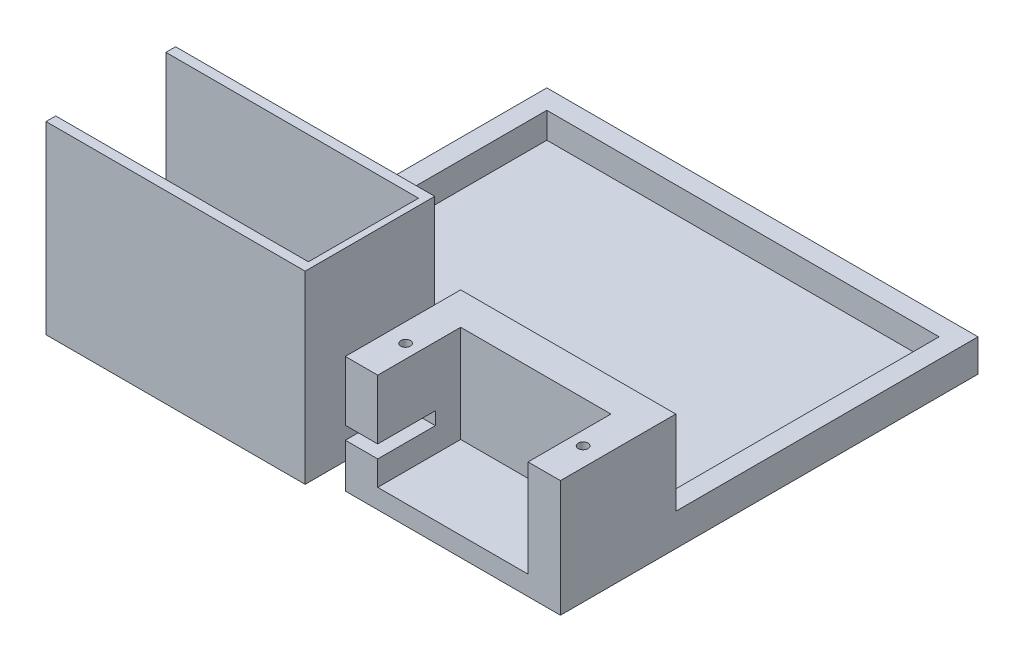
ISO-10303-21;
HEADER;
FILE_DESCRIPTION(('STEP AP214'),'2;1');
FILE_NAME('part.step','',(''),(''),'','','');
FILE_SCHEMA(('AUTOMOTIVE_DESIGN { 1 0 10303 214 1 1 1 1 }'));
ENDSEC;
DATA;
#1=APPLICATION_CONTEXT('core data for automotive mechanical design processes');
#2=APPLICATION_PROTOCOL_DEFINITION('international standard','automotive_design',2000,#1);
#3=PRODUCT_CONTEXT('',#1,'mechanical');
#4=PRODUCT('Part','Part','',(#3));
#5=PRODUCT_RELATED_PRODUCT_CATEGORY('part','',(#4));
#6=PRODUCT_DEFINITION_FORMATION('','',#4);
#7=PRODUCT_DEFINITION_CONTEXT('part definition',#1,'design');
#8=PRODUCT_DEFINITION('design','',#6,#7);
#9=PRODUCT_DEFINITION_SHAPE('','',#8);
#10=(LENGTH_UNIT() NAMED_UNIT(*) SI_UNIT(.MILLI.,.METRE.));
#11=(NAMED_UNIT(*) PLANE_ANGLE_UNIT() SI_UNIT($,.RADIAN.));
#12=(NAMED_UNIT(*) SI_UNIT($,.STERADIAN.) SOLID_ANGLE_UNIT());
#13=UNCERTAINTY_MEASURE_WITH_UNIT(LENGTH_MEASURE(1.E-05),#10,'distance_accuracy_value','');
#14=(GEOMETRIC_REPRESENTATION_CONTEXT(3) GLOBAL_UNCERTAINTY_ASSIGNED_CONTEXT((#13)) GLOBAL_UNIT_ASSIGNED_CONTEXT((#10,
#11,#12)) REPRESENTATION_CONTEXT('',''));
#15=CARTESIAN_POINT('',(0.,0.,0.));
#16=DIRECTION('',(0.,0.,1.));
#17=DIRECTION('',(1.,0.,0.));
#18=AXIS2_PLACEMENT_3D('',#15,#16,#17);
#19=CARTESIAN_POINT('',(-38.65,1.7,-17.5));
#20=DIRECTION('',(0.,0.,1.));
#21=DIRECTION('',(1.,0.,0.));
#22=AXIS2_PLACEMENT_3D('',#19,#20,#21);
#23=PLANE('',#22);
#24=DIRECTION('',(-1.,0.,0.));
#25=VECTOR('',#24,1.);
#26=CARTESIAN_POINT('',(-38.65,1.7,-17.5));
#27=LINE('',#26,#25);
#28=CARTESIAN_POINT('',(-5.3,1.7,-17.5));
#29=VERTEX_POINT('',#28);
#30=CARTESIAN_POINT('',(-9.3,1.7,-17.5));
#31=VERTEX_POINT('',#30);
#32=EDGE_CURVE('E446',#29,#31,#27,.T.);
#33=ORIENTED_EDGE('',*,*,#32,.T.);
#34=DIRECTION('',(0.,-1.,0.));
#35=VECTOR('',#34,1.);
#36=CARTESIAN_POINT('',(-9.3,1.7,-17.5));
#37=LINE('',#36,#35);
#38=CARTESIAN_POINT('',(-9.3,-3.3,-17.5));
#39=VERTEX_POINT('',#38);
#40=EDGE_CURVE('E11',#31,#39,#37,.T.);
#41=ORIENTED_EDGE('',*,*,#40,.T.);
#42=DIRECTION('',(-1.,0.,0.));
#43=VECTOR('',#42,1.);
#44=CARTESIAN_POINT('',(-38.65,-3.3,-17.5));
#45=LINE('',#44,#43);
#46=CARTESIAN_POINT('',(-5.3,-3.3,-17.5));
#47=VERTEX_POINT('',#46);
#48=EDGE_CURVE('E454',#47,#39,#45,.T.);
#49=ORIENTED_EDGE('',*,*,#48,.F.);
#50=DIRECTION('',(0.,-1.,0.));
#51=VECTOR('',#50,1.);
#52=CARTESIAN_POINT('',(-5.3,55.275054314054,-17.5));
#53=LINE('',#52,#51);
#54=EDGE_CURVE('E543',#29,#47,#53,.T.);
#55=ORIENTED_EDGE('',*,*,#54,.F.);
#56=EDGE_LOOP('',(#33,#41,#49,#55));
#57=FACE_BOUND('',#56,.T.);
#58=ADVANCED_FACE('F38',(#57),#23,.T.);
#59=CARTESIAN_POINT('',(-5.3,-3.301,0.3));
#60=DIRECTION('',(0.,0.,-1.));
#61=DIRECTION('',(-1.,0.,0.));
#62=AXIS2_PLACEMENT_3D('',#59,#60,#61);
#63=PLANE('',#62);
#64=DIRECTION('',(0.,-1.,0.));
#65=VECTOR('',#64,1.);
#66=CARTESIAN_POINT('',(-0.3,55.275054314054,0.3));
#67=LINE('',#66,#65);
#68=CARTESIAN_POINT('',(-0.300000000000002,3.5,0.300000000000001));
#69=VERTEX_POINT('',#68);
#70=CARTESIAN_POINT('',(-0.3,-0.3,0.3));
#71=VERTEX_POINT('',#70);
#72=EDGE_CURVE('E518',#69,#71,#67,.T.);
#73=ORIENTED_EDGE('',*,*,#72,.F.);
#74=DIRECTION('',(-1.,0.,0.));
#75=VECTOR('',#74,1.);
#76=CARTESIAN_POINT('',(27.901,3.5,0.3));
#77=LINE('',#76,#75);
#78=CARTESIAN_POINT('',(-5.3,3.5,0.3));
#79=VERTEX_POINT('',#78);
#80=EDGE_CURVE('E324',#69,#79,#77,.T.);
#81=ORIENTED_EDGE('',*,*,#80,.T.);
#82=DIRECTION('',(0.,1.,0.));
#83=VECTOR('',#82,1.);
#84=CARTESIAN_POINT('',(-5.3,-3.301,0.3));
#85=LINE('',#84,#83);
#86=CARTESIAN_POINT('',(-5.3,-3.3,0.300000000000001));
#87=VERTEX_POINT('',#86);
#88=EDGE_CURVE('E341',#87,#79,#85,.T.);
#89=ORIENTED_EDGE('',*,*,#88,.F.);
#90=DIRECTION('',(-1.,0.,0.));
#91=VECTOR('',#90,1.);
#92=CARTESIAN_POINT('',(-5.3,-3.3,0.3));
#93=LINE('',#92,#91);
#94=CARTESIAN_POINT('',(27.9,-3.3,0.300000000000002));
#95=VERTEX_POINT('',#94);
#96=EDGE_CURVE('E329',#95,#87,#93,.T.);
#97=ORIENTED_EDGE('',*,*,#96,.F.);
#98=DIRECTION('',(0.,1.,0.));
#99=VECTOR('',#98,1.);
#100=CARTESIAN_POINT('',(27.9,-3.301,0.300000000000002));
#101=LINE('',#100,#99);
#102=CARTESIAN_POINT('',(27.9,14.7,0.300000000000002));
#103=VERTEX_POINT('',#102);
#104=EDGE_CURVE('E340',#95,#103,#101,.T.);
#105=ORIENTED_EDGE('',*,*,#104,.T.);
#106=DIRECTION('',(-1.,0.,0.));
#107=VECTOR('',#106,1.);
#108=CARTESIAN_POINT('',(-5.3,14.7,0.3));
#109=LINE('',#108,#107);
#110=CARTESIAN_POINT('',(22.9,14.7,0.300000000000001));
#111=VERTEX_POINT('',#110);
#112=EDGE_CURVE('E337',#103,#111,#109,.T.);
#113=ORIENTED_EDGE('',*,*,#112,.T.);
#114=DIRECTION('',(0.,-1.,0.));
#115=VECTOR('',#114,1.);
#116=CARTESIAN_POINT('',(22.9,55.275054314054,0.3));
#117=LINE('',#116,#115);
#118=CARTESIAN_POINT('',(22.9,-0.3,0.300000000000001));
#119=VERTEX_POINT('',#118);
#120=EDGE_CURVE('E508',#111,#119,#117,.T.);
#121=ORIENTED_EDGE('',*,*,#120,.T.);
#122=DIRECTION('',(-1.,0.,0.));
#123=VECTOR('',#122,1.);
#124=CARTESIAN_POINT('',(22.9,-0.3,0.3));
#125=LINE('',#124,#123);
#126=EDGE_CURVE('E503',#119,#71,#125,.T.);
#127=ORIENTED_EDGE('',*,*,#126,.T.);
#128=EDGE_LOOP('',(#73,#81,#89,#97,#105,#113,#121,#127));
#129=FACE_BOUND('',#128,.T.);
#130=ADVANCED_FACE('F600',(#129),#63,.F.);
#131=CARTESIAN_POINT('',(-38.65,1.7,-17.5));
#132=DIRECTION('',(-1.,0.,0.));
#133=DIRECTION('',(0.,0.,1.));
#134=AXIS2_PLACEMENT_3D('',#131,#132,#133);
#135=PLANE('',#134);
#136=DIRECTION('',(0.,0.,-1.));
#137=VECTOR('',#136,1.);
#138=CARTESIAN_POINT('',(-38.65,-2.3,-17.5));
#139=LINE('',#138,#137);
#140=CARTESIAN_POINT('',(-38.65,-2.3,-20.5));
#141=VERTEX_POINT('',#140);
#142=CARTESIAN_POINT('',(-38.65,-2.3,-40.825));
#143=VERTEX_POINT('',#142);
#144=EDGE_CURVE('E379',#141,#143,#139,.T.);
#145=ORIENTED_EDGE('',*,*,#144,.T.);
#146=DIRECTION('',(0.,1.,0.));
#147=VECTOR('',#146,1.);
#148=CARTESIAN_POINT('',(-38.65,1.7,-40.825));
#149=LINE('',#148,#147);
#150=CARTESIAN_POINT('',(-38.65,1.7,-40.825));
#151=VERTEX_POINT('',#150);
#152=EDGE_CURVE('E383',#143,#151,#149,.T.);
#153=ORIENTED_EDGE('',*,*,#152,.T.);
#154=DIRECTION('',(0.,0.,-1.));
#155=VECTOR('',#154,1.);
#156=CARTESIAN_POINT('',(-38.65,1.7,-17.5));
#157=LINE('',#156,#155);
#158=CARTESIAN_POINT('',(-38.65,1.7,-64.15));
#159=VERTEX_POINT('',#158);
#160=EDGE_CURVE('E433',#151,#159,#157,.T.);
#161=ORIENTED_EDGE('',*,*,#160,.T.);
#162=DIRECTION('',(0.,-1.,0.));
#163=VECTOR('',#162,1.);
#164=CARTESIAN_POINT('',(-38.65,1.7,-64.15));
#165=LINE('',#164,#163);
#166=CARTESIAN_POINT('',(-38.65,-3.3,-64.15));
#167=VERTEX_POINT('',#166);
#168=EDGE_CURVE('E445',#159,#167,#165,.T.);
#169=ORIENTED_EDGE('',*,*,#168,.T.);
#170=DIRECTION('',(0.,0.,-1.));
#171=VECTOR('',#170,1.);
#172=CARTESIAN_POINT('',(-38.65,-3.3,-17.5));
#173=LINE('',#172,#171);
#174=CARTESIAN_POINT('',(-38.65,-3.3,-17.5));
#175=VERTEX_POINT('',#174);
#176=EDGE_CURVE('E421',#175,#167,#173,.T.);
#177=ORIENTED_EDGE('',*,*,#176,.F.);
#178=DIRECTION('',(0.,-1.,0.));
#179=VECTOR('',#178,1.);
#180=CARTESIAN_POINT('',(-38.65,1.7,-17.5));
#181=LINE('',#180,#179);
#182=CARTESIAN_POINT('',(-38.65,1.7,-17.5));
#183=VERTEX_POINT('',#182);
#184=EDGE_CURVE('E458',#183,#175,#181,.T.);
#185=ORIENTED_EDGE('',*,*,#184,.F.);
#186=CARTESIAN_POINT('',(-38.65,1.7,-20.5));
#187=VERTEX_POINT('',#186);
#188=EDGE_CURVE('E428',#183,#187,#157,.T.);
#189=ORIENTED_EDGE('',*,*,#188,.T.);
#190=DIRECTION('',(0.,-1.,0.));
#191=VECTOR('',#190,1.);
#192=CARTESIAN_POINT('',(-38.65,1.7,-20.5));
#193=LINE('',#192,#191);
#194=EDGE_CURVE('E375',#187,#141,#193,.T.);
#195=ORIENTED_EDGE('',*,*,#194,.T.);
#196=EDGE_LOOP('',(#145,#153,#161,#169,#177,#185,#189,#195));
#197=FACE_BOUND('',#196,.T.);
#198=ADVANCED_FACE('F636',(#197),#135,.T.);
#199=CARTESIAN_POINT('',(0.,1.7,0.));
#200=DIRECTION('',(0.,-1.,0.));
#201=DIRECTION('',(0.,0.,-1.));
#202=AXIS2_PLACEMENT_3D('',#199,#200,#201);
#203=PLANE('',#202);
#204=DIRECTION('',(1.,0.,0.));
#205=VECTOR('',#204,1.);
#206=CARTESIAN_POINT('',(-39.65,1.7,-40.825));
#207=LINE('',#206,#205);
#208=CARTESIAN_POINT('',(-35.65,1.7,-40.825));
#209=VERTEX_POINT('',#208);
#210=EDGE_CURVE('E368',#151,#209,#207,.T.);
#211=ORIENTED_EDGE('',*,*,#210,.T.);
#212=DIRECTION('',(0.,0.,1.));
#213=VECTOR('',#212,1.);
#214=CARTESIAN_POINT('',(-35.65,1.7,-61.15));
#215=LINE('',#214,#213);
#216=CARTESIAN_POINT('',(-35.65,1.7,-61.15));
#217=VERTEX_POINT('',#216);
#218=EDGE_CURVE('E411',#217,#209,#215,.T.);
#219=ORIENTED_EDGE('',*,*,#218,.F.);
#220=DIRECTION('',(-1.,0.,0.));
#221=VECTOR('',#220,1.);
#222=CARTESIAN_POINT('',(24.9,1.7,-61.15));
#223=LINE('',#222,#221);
#224=CARTESIAN_POINT('',(24.9,1.7,-61.15));
#225=VERTEX_POINT('',#224);
#226=EDGE_CURVE('E407',#225,#217,#223,.T.);
#227=ORIENTED_EDGE('',*,*,#226,.F.);
#228=DIRECTION('',(0.,0.,-1.));
#229=VECTOR('',#228,1.);
#230=CARTESIAN_POINT('',(24.9,1.7,-20.5));
#231=LINE('',#230,#229);
#232=CARTESIAN_POINT('',(24.9,1.7,-20.5));
#233=VERTEX_POINT('',#232);
#234=EDGE_CURVE('E387',#233,#225,#231,.T.);
#235=ORIENTED_EDGE('',*,*,#234,.F.);
#236=DIRECTION('',(1.,0.,0.));
#237=VECTOR('',#236,1.);
#238=CARTESIAN_POINT('',(-5.3,1.7,-20.5));
#239=LINE('',#238,#237);
#240=EDGE_CURVE('E393',#187,#233,#239,.T.);
#241=ORIENTED_EDGE('',*,*,#240,.F.);
#242=ORIENTED_EDGE('',*,*,#188,.F.);
#243=EDGE_CURVE('E440',#31,#183,#27,.T.);
#244=ORIENTED_EDGE('',*,*,#243,.F.);
#245=ORIENTED_EDGE('',*,*,#32,.F.);
#246=CARTESIAN_POINT('',(27.9,1.7,-17.5));
#247=VERTEX_POINT('',#246);
#248=EDGE_CURVE('E441',#247,#29,#27,.T.);
#249=ORIENTED_EDGE('',*,*,#248,.F.);
#250=DIRECTION('',(0.,0.,1.));
#251=VECTOR('',#250,1.);
#252=CARTESIAN_POINT('',(27.9,1.7,-17.5));
#253=LINE('',#252,#251);
#254=CARTESIAN_POINT('',(27.9,1.7,-64.15));
#255=VERTEX_POINT('',#254);
#256=EDGE_CURVE('E437',#255,#247,#253,.T.);
#257=ORIENTED_EDGE('',*,*,#256,.F.);
#258=DIRECTION('',(1.,0.,0.));
#259=VECTOR('',#258,1.);
#260=CARTESIAN_POINT('',(-38.65,1.7,-64.15));
#261=LINE('',#260,#259);
#262=EDGE_CURVE('E432',#159,#255,#261,.T.);
#263=ORIENTED_EDGE('',*,*,#262,.F.);
#264=ORIENTED_EDGE('',*,*,#160,.F.);
#265=EDGE_LOOP('',(#211,#219,#227,#235,#241,#242,#244,#245,#249,#257,#263,#264));
#266=FACE_BOUND('',#265,.T.);
#267=ADVANCED_FACE('F646',(#266),#203,.F.);
#268=CARTESIAN_POINT('',(-35.65,-2.3,-61.15));
#269=DIRECTION('',(-1.,0.,0.));
#270=DIRECTION('',(0.,0.,1.));
#271=AXIS2_PLACEMENT_3D('',#268,#269,#270);
#272=PLANE('',#271);
#273=DIRECTION('',(0.,-1.,0.));
#274=VECTOR('',#273,1.);
#275=CARTESIAN_POINT('',(-35.65,1.7,-40.825));
#276=LINE('',#275,#274);
#277=CARTESIAN_POINT('',(-35.65,-2.3,-40.825));
#278=VERTEX_POINT('',#277);
#279=EDGE_CURVE('E353',#209,#278,#276,.T.);
#280=ORIENTED_EDGE('',*,*,#279,.T.);
#281=DIRECTION('',(0.,0.,1.));
#282=VECTOR('',#281,1.);
#283=CARTESIAN_POINT('',(-35.65,-2.3,-61.15));
#284=LINE('',#283,#282);
#285=CARTESIAN_POINT('',(-35.65,-2.3,-61.15));
#286=VERTEX_POINT('',#285);
#287=EDGE_CURVE('E397',#286,#278,#284,.T.);
#288=ORIENTED_EDGE('',*,*,#287,.F.);
#289=DIRECTION('',(0.,1.,0.));
#290=VECTOR('',#289,1.);
#291=CARTESIAN_POINT('',(-35.65,-2.3,-61.15));
#292=LINE('',#291,#290);
#293=EDGE_CURVE('E422',#286,#217,#292,.T.);
#294=ORIENTED_EDGE('',*,*,#293,.T.);
#295=ORIENTED_EDGE('',*,*,#218,.T.);
#296=EDGE_LOOP('',(#280,#288,#294,#295));
#297=FACE_BOUND('',#296,.T.);
#298=ADVANCED_FACE('F702',(#297),#272,.F.);
#299=CARTESIAN_POINT('',(27.9,55.275054314054,-17.5));
#300=DIRECTION('',(0.,0.,-1.));
#301=DIRECTION('',(-1.,0.,0.));
#302=AXIS2_PLACEMENT_3D('',#299,#300,#301);
#303=PLANE('',#302);
#304=DIRECTION('',(0.,-1.,0.));
#305=VECTOR('',#304,1.);
#306=CARTESIAN_POINT('',(27.9,55.275054314054,-17.5));
#307=LINE('',#306,#305);
#308=CARTESIAN_POINT('',(27.9,14.7,-17.5));
#309=VERTEX_POINT('',#308);
#310=EDGE_CURVE('E539',#309,#247,#307,.T.);
#311=ORIENTED_EDGE('',*,*,#310,.T.);
#312=ORIENTED_EDGE('',*,*,#248,.T.);
#313=CARTESIAN_POINT('',(-5.3,14.7,-17.5));
#314=VERTEX_POINT('',#313);
#315=EDGE_CURVE('E550',#314,#29,#53,.T.);
#316=ORIENTED_EDGE('',*,*,#315,.F.);
#317=DIRECTION('',(1.,0.,0.));
#318=VECTOR('',#317,1.);
#319=CARTESIAN_POINT('',(27.9,14.7,-17.5));
#320=LINE('',#319,#318);
#321=EDGE_CURVE('E535',#314,#309,#320,.T.);
#322=ORIENTED_EDGE('',*,*,#321,.T.);
#323=EDGE_LOOP('',(#311,#312,#316,#322));
#324=FACE_BOUND('',#323,.T.);
#325=ADVANCED_FACE('F611',(#324),#303,.T.);
#326=CARTESIAN_POINT('',(27.9,55.275054314054,-17.5));
#327=DIRECTION('',(1.,0.,0.));
#328=DIRECTION('',(0.,0.,-1.));
#329=AXIS2_PLACEMENT_3D('',#326,#327,#328);
#330=PLANE('',#329);
#331=ORIENTED_EDGE('',*,*,#104,.F.);
#332=DIRECTION('',(0.,0.,1.));
#333=VECTOR('',#332,1.);
#334=CARTESIAN_POINT('',(27.9,-3.3,-17.5));
#335=LINE('',#334,#333);
#336=CARTESIAN_POINT('',(27.9,-3.3,-64.15));
#337=VERTEX_POINT('',#336);
#338=EDGE_CURVE('E495',#337,#95,#335,.T.);
#339=ORIENTED_EDGE('',*,*,#338,.F.);
#340=DIRECTION('',(0.,-1.,0.));
#341=VECTOR('',#340,1.);
#342=CARTESIAN_POINT('',(27.9,1.7,-64.15));
#343=LINE('',#342,#341);
#344=EDGE_CURVE('E462',#255,#337,#343,.T.);
#345=ORIENTED_EDGE('',*,*,#344,.F.);
#346=ORIENTED_EDGE('',*,*,#256,.T.);
#347=ORIENTED_EDGE('',*,*,#310,.F.);
#348=DIRECTION('',(0.,0.,1.));
#349=VECTOR('',#348,1.);
#350=CARTESIAN_POINT('',(27.9,14.7,-17.5));
#351=LINE('',#350,#349);
#352=EDGE_CURVE('E502',#309,#103,#351,.T.);
#353=ORIENTED_EDGE('',*,*,#352,.T.);
#354=EDGE_LOOP('',(#331,#339,#345,#346,#347,#353));
#355=FACE_BOUND('',#354,.T.);
#356=ADVANCED_FACE('F606',(#355),#330,.T.);
#357=CARTESIAN_POINT('',(-5.3,55.275054314054,-17.5));
#358=DIRECTION('',(-1.,0.,0.));
#359=DIRECTION('',(0.,0.,1.));
#360=AXIS2_PLACEMENT_3D('',#357,#358,#359);
#361=PLANE('',#360);
#362=ORIENTED_EDGE('',*,*,#88,.T.);
#363=DIRECTION('',(0.,0.,1.));
#364=VECTOR('',#363,1.);
#365=CARTESIAN_POINT('',(-5.3,3.5,-8.6));
#366=LINE('',#365,#364);
#367=CARTESIAN_POINT('',(-5.3,3.5,-8.6));
#368=VERTEX_POINT('',#367);
#369=EDGE_CURVE('E476',#368,#79,#366,.T.);
#370=ORIENTED_EDGE('',*,*,#369,.F.);
#371=DIRECTION('',(0.,-1.,0.));
#372=VECTOR('',#371,1.);
#373=CARTESIAN_POINT('',(-5.3,5.5,-8.6));
#374=LINE('',#373,#372);
#375=CARTESIAN_POINT('',(-5.3,5.5,-8.6));
#376=VERTEX_POINT('',#375);
#377=EDGE_CURVE('E480',#376,#368,#374,.T.);
#378=ORIENTED_EDGE('',*,*,#377,.F.);
#379=DIRECTION('',(0.,0.,1.));
#380=VECTOR('',#379,1.);
#381=CARTESIAN_POINT('',(-5.3,5.5,-8.6));
#382=LINE('',#381,#380);
#383=CARTESIAN_POINT('',(-5.3,5.5,0.300000000000001));
#384=VERTEX_POINT('',#383);
#385=EDGE_CURVE('E471',#376,#384,#382,.T.);
#386=ORIENTED_EDGE('',*,*,#385,.T.);
#387=CARTESIAN_POINT('',(-5.3,14.7,0.3));
#388=VERTEX_POINT('',#387);
#389=EDGE_CURVE('E346',#384,#388,#85,.T.);
#390=ORIENTED_EDGE('',*,*,#389,.T.);
#391=DIRECTION('',(0.,0.,-1.));
#392=VECTOR('',#391,1.);
#393=CARTESIAN_POINT('',(-5.3,14.7,-17.5));
#394=LINE('',#393,#392);
#395=EDGE_CURVE('E540',#388,#314,#394,.T.);
#396=ORIENTED_EDGE('',*,*,#395,.T.);
#397=ORIENTED_EDGE('',*,*,#315,.T.);
#398=ORIENTED_EDGE('',*,*,#54,.T.);
#399=DIRECTION('',(0.,0.,-1.));
#400=VECTOR('',#399,1.);
#401=CARTESIAN_POINT('',(-5.3,-3.3,5.3));
#402=LINE('',#401,#400);
#403=EDGE_CURVE('E499',#87,#47,#402,.T.);
#404=ORIENTED_EDGE('',*,*,#403,.F.);
#405=EDGE_LOOP('',(#362,#370,#378,#386,#390,#396,#397,#398,#404));
#406=FACE_BOUND('',#405,.T.);
#407=ADVANCED_FACE('F613',(#406),#361,.T.);
#408=CARTESIAN_POINT('',(22.9,55.275054314054,-12.5));
#409=DIRECTION('',(1.,0.,0.));
#410=DIRECTION('',(0.,0.,-1.));
#411=AXIS2_PLACEMENT_3D('',#408,#409,#410);
#412=PLANE('',#411);
#413=DIRECTION('',(0.,0.,1.));
#414=VECTOR('',#413,1.);
#415=CARTESIAN_POINT('',(22.9,14.7,-12.5));
#416=LINE('',#415,#414);
#417=CARTESIAN_POINT('',(22.9,14.7,-12.5));
#418=VERTEX_POINT('',#417);
#419=EDGE_CURVE('E523',#418,#111,#416,.T.);
#420=ORIENTED_EDGE('',*,*,#419,.F.);
#421=DIRECTION('',(0.,-1.,0.));
#422=VECTOR('',#421,1.);
#423=CARTESIAN_POINT('',(22.9,55.275054314054,-12.5));
#424=LINE('',#423,#422);
#425=CARTESIAN_POINT('',(22.9,-0.3,-12.5));
#426=VERTEX_POINT('',#425);
#427=EDGE_CURVE('E507',#418,#426,#424,.T.);
#428=ORIENTED_EDGE('',*,*,#427,.T.);
#429=DIRECTION('',(0.,0.,1.));
#430=VECTOR('',#429,1.);
#431=CARTESIAN_POINT('',(22.9,-0.3,-12.5));
#432=LINE('',#431,#430);
#433=EDGE_CURVE('E509',#426,#119,#432,.T.);
#434=ORIENTED_EDGE('',*,*,#433,.T.);
#435=ORIENTED_EDGE('',*,*,#120,.F.);
#436=EDGE_LOOP('',(#420,#428,#434,#435));
#437=FACE_BOUND('',#436,.T.);
#438=ADVANCED_FACE('F577',(#437),#412,.F.);
#439=CARTESIAN_POINT('',(22.9,55.275054314054,-12.5));
#440=DIRECTION('',(0.,0.,-1.));
#441=DIRECTION('',(-1.,0.,0.));
#442=AXIS2_PLACEMENT_3D('',#439,#440,#441);
#443=PLANE('',#442);
#444=DIRECTION('',(1.,0.,0.));
#445=VECTOR('',#444,1.);
#446=CARTESIAN_POINT('',(22.9,14.7,-12.5));
#447=LINE('',#446,#445);
#448=CARTESIAN_POINT('',(-0.3,14.7,-12.5));
#449=VERTEX_POINT('',#448);
#450=EDGE_CURVE('E47',#449,#418,#447,.T.);
#451=ORIENTED_EDGE('',*,*,#450,.F.);
#452=DIRECTION('',(0.,-1.,0.));
#453=VECTOR('',#452,1.);
#454=CARTESIAN_POINT('',(-0.3,55.275054314054,-12.5));
#455=LINE('',#454,#453);
#456=CARTESIAN_POINT('',(-0.3,-0.3,-12.5));
#457=VERTEX_POINT('',#456);
#458=EDGE_CURVE('E513',#449,#457,#455,.T.);
#459=ORIENTED_EDGE('',*,*,#458,.T.);
#460=DIRECTION('',(1.,0.,0.));
#461=VECTOR('',#460,1.);
#462=CARTESIAN_POINT('',(22.9,-0.3,-12.5));
#463=LINE('',#462,#461);
#464=EDGE_CURVE('E514',#457,#426,#463,.T.);
#465=ORIENTED_EDGE('',*,*,#464,.T.);
#466=ORIENTED_EDGE('',*,*,#427,.F.);
#467=EDGE_LOOP('',(#451,#459,#465,#466));
#468=FACE_BOUND('',#467,.T.);
#469=ADVANCED_FACE('F565',(#468),#443,.F.);
#470=CARTESIAN_POINT('',(-0.3,55.275054314054,-12.5));
#471=DIRECTION('',(-1.,0.,0.));
#472=DIRECTION('',(0.,0.,1.));
#473=AXIS2_PLACEMENT_3D('',#470,#471,#472);
#474=PLANE('',#473);
#475=DIRECTION('',(0.,0.,-1.));
#476=VECTOR('',#475,1.);
#477=CARTESIAN_POINT('',(-0.300000000000002,3.5,-8.6));
#478=LINE('',#477,#476);
#479=CARTESIAN_POINT('',(-0.3,3.5,-8.6));
#480=VERTEX_POINT('',#479);
#481=EDGE_CURVE('E461',#69,#480,#478,.T.);
#482=ORIENTED_EDGE('',*,*,#481,.F.);
#483=ORIENTED_EDGE('',*,*,#72,.T.);
#484=DIRECTION('',(0.,0.,-1.));
#485=VECTOR('',#484,1.);
#486=CARTESIAN_POINT('',(-0.3,-0.3,-12.5));
#487=LINE('',#486,#485);
#488=EDGE_CURVE('E519',#71,#457,#487,.T.);
#489=ORIENTED_EDGE('',*,*,#488,.T.);
#490=ORIENTED_EDGE('',*,*,#458,.F.);
#491=DIRECTION('',(0.,0.,-1.));
#492=VECTOR('',#491,1.);
#493=CARTESIAN_POINT('',(-0.3,14.7,-12.5));
#494=LINE('',#493,#492);
#495=CARTESIAN_POINT('',(-0.3,14.7,0.3));
#496=VERTEX_POINT('',#495);
#497=EDGE_CURVE('E528',#496,#449,#494,.T.);
#498=ORIENTED_EDGE('',*,*,#497,.F.);
#499=CARTESIAN_POINT('',(-0.3,5.5,0.3));
#500=VERTEX_POINT('',#499);
#501=EDGE_CURVE('E524',#496,#500,#67,.T.);
#502=ORIENTED_EDGE('',*,*,#501,.T.);
#503=DIRECTION('',(0.,0.,-1.));
#504=VECTOR('',#503,1.);
#505=CARTESIAN_POINT('',(-0.300000000000002,5.5,-8.6));
#506=LINE('',#505,#504);
#507=CARTESIAN_POINT('',(-0.300000000000002,5.5,-8.6));
#508=VERTEX_POINT('',#507);
#509=EDGE_CURVE('E479',#500,#508,#506,.T.);
#510=ORIENTED_EDGE('',*,*,#509,.T.);
#511=DIRECTION('',(0.,1.,0.));
#512=VECTOR('',#511,1.);
#513=CARTESIAN_POINT('',(-0.300000000000002,5.5,-8.6));
#514=LINE('',#513,#512);
#515=EDGE_CURVE('E470',#480,#508,#514,.T.);
#516=ORIENTED_EDGE('',*,*,#515,.F.);
#517=EDGE_LOOP('',(#482,#483,#489,#490,#498,#502,#510,#516));
#518=FACE_BOUND('',#517,.T.);
#519=ADVANCED_FACE('F570',(#518),#474,.F.);
#520=CARTESIAN_POINT('',(0.,14.7,0.));
#521=DIRECTION('',(0.,1.,0.));
#522=DIRECTION('',(0.,0.,1.));
#523=AXIS2_PLACEMENT_3D('',#520,#521,#522);
#524=PLANE('',#523);
#525=ORIENTED_EDGE('',*,*,#112,.F.);
#526=ORIENTED_EDGE('',*,*,#352,.F.);
#527=ORIENTED_EDGE('',*,*,#321,.F.);
#528=ORIENTED_EDGE('',*,*,#395,.F.);
#529=EDGE_CURVE('E336',#496,#388,#109,.T.);
#530=ORIENTED_EDGE('',*,*,#529,.F.);
#531=ORIENTED_EDGE('',*,*,#497,.T.);
#532=ORIENTED_EDGE('',*,*,#450,.T.);
#533=ORIENTED_EDGE('',*,*,#419,.T.);
#534=EDGE_LOOP('',(#525,#526,#527,#528,#530,#531,#532,#533));
#535=FACE_BOUND('',#534,.T.);
#536=CARTESIAN_POINT('',(-2.4,14.7,-6.1));
#537=DIRECTION('',(0.,1.,0.));
#538=DIRECTION('',(0.,0.,1.));
#539=AXIS2_PLACEMENT_3D('',#536,#537,#538);
#540=CIRCLE('',#539,0.75);
#541=CARTESIAN_POINT('',(-2.4,14.7,-5.35));
#542=VERTEX_POINT('',#541);
#543=EDGE_CURVE('E354',#542,#542,#540,.T.);
#544=ORIENTED_EDGE('',*,*,#543,.F.);
#545=EDGE_LOOP('',(#544));
#546=FACE_BOUND('',#545,.T.);
#547=CARTESIAN_POINT('',(25.,14.7,-6.1));
#548=DIRECTION('',(0.,1.,0.));
#549=DIRECTION('',(0.,0.,1.));
#550=AXIS2_PLACEMENT_3D('',#547,#548,#549);
#551=CIRCLE('',#550,0.750000000000002);
#552=CARTESIAN_POINT('',(25.,14.7,-5.35));
#553=VERTEX_POINT('',#552);
#554=EDGE_CURVE('E345',#553,#553,#551,.T.);
#555=ORIENTED_EDGE('',*,*,#554,.F.);
#556=EDGE_LOOP('',(#555));
#557=FACE_BOUND('',#556,.T.);
#558=ADVANCED_FACE('F40',(#535,#546,#557),#524,.T.);
#559=CARTESIAN_POINT('',(0.,-0.3,0.));
#560=DIRECTION('',(0.,-1.,0.));
#561=DIRECTION('',(0.,0.,-1.));
#562=AXIS2_PLACEMENT_3D('',#559,#560,#561);
#563=PLANE('',#562);
#564=ORIENTED_EDGE('',*,*,#126,.F.);
#565=ORIENTED_EDGE('',*,*,#433,.F.);
#566=ORIENTED_EDGE('',*,*,#464,.F.);
#567=ORIENTED_EDGE('',*,*,#488,.F.);
#568=EDGE_LOOP('',(#564,#565,#566,#567));
#569=FACE_BOUND('',#568,.T.);
#570=ADVANCED_FACE('F574',(#569),#563,.F.);
#571=CARTESIAN_POINT('',(0.,-3.3,0.));
#572=DIRECTION('',(0.,-1.,0.));
#573=DIRECTION('',(0.,0.,-1.));
#574=AXIS2_PLACEMENT_3D('',#571,#572,#573);
#575=PLANE('',#574);
#576=ORIENTED_EDGE('',*,*,#96,.T.);
#577=ORIENTED_EDGE('',*,*,#403,.T.);
#578=ORIENTED_EDGE('',*,*,#48,.T.);
#579=DIRECTION('',(0.,0.,1.));
#580=VECTOR('',#579,1.);
#581=CARTESIAN_POINT('',(-9.3,-3.3,-17.5));
#582=LINE('',#581,#580);
#583=CARTESIAN_POINT('',(-9.3,-3.3,2.50000000000001));
#584=VERTEX_POINT('',#583);
#585=EDGE_CURVE('E62',#39,#584,#582,.T.);
#586=ORIENTED_EDGE('',*,*,#585,.T.);
#587=DIRECTION('',(1.,0.,0.));
#588=VECTOR('',#587,1.);
#589=CARTESIAN_POINT('',(-49.3,-3.3,2.50000000000001));
#590=LINE('',#589,#588);
#591=CARTESIAN_POINT('',(-49.3,-3.3,2.50000000000001));
#592=VERTEX_POINT('',#591);
#593=EDGE_CURVE('E316',#592,#584,#590,.T.);
#594=ORIENTED_EDGE('',*,*,#593,.F.);
#595=DIRECTION('',(0.,0.,1.));
#596=VECTOR('',#595,1.);
#597=CARTESIAN_POINT('',(-49.3,-3.3,-17.5));
#598=LINE('',#597,#596);
#599=CARTESIAN_POINT('',(-49.3,-3.3,-17.5));
#600=VERTEX_POINT('',#599);
#601=EDGE_CURVE('E286',#600,#592,#598,.T.);
#602=ORIENTED_EDGE('',*,*,#601,.F.);
#603=DIRECTION('',(1.,0.,0.));
#604=VECTOR('',#603,1.);
#605=CARTESIAN_POINT('',(-49.3,-3.3,-17.5));
#606=LINE('',#605,#604);
#607=EDGE_CURVE('E320',#600,#175,#606,.T.);
#608=ORIENTED_EDGE('',*,*,#607,.T.);
#609=ORIENTED_EDGE('',*,*,#176,.T.);
#610=DIRECTION('',(1.,0.,0.));
#611=VECTOR('',#610,1.);
#612=CARTESIAN_POINT('',(-38.65,-3.3,-64.15));
#613=LINE('',#612,#611);
#614=EDGE_CURVE('E450',#167,#337,#613,.T.);
#615=ORIENTED_EDGE('',*,*,#614,.T.);
#616=ORIENTED_EDGE('',*,*,#338,.T.);
#617=EDGE_LOOP('',(#576,#577,#578,#586,#594,#602,#608,#609,#615,#616));
#618=FACE_BOUND('',#617,.T.);
#619=ADVANCED_FACE('F633',(#618),#575,.T.);
#620=CARTESIAN_POINT('',(27.901,3.5,-8.6));
#621=DIRECTION('',(0.,-1.,0.));
#622=DIRECTION('',(0.,0.,-1.));
#623=AXIS2_PLACEMENT_3D('',#620,#621,#622);
#624=PLANE('',#623);
#625=ORIENTED_EDGE('',*,*,#481,.T.);
#626=DIRECTION('',(-1.,0.,0.));
#627=VECTOR('',#626,1.);
#628=CARTESIAN_POINT('',(27.901,3.5,-8.6));
#629=LINE('',#628,#627);
#630=EDGE_CURVE('E474',#480,#368,#629,.T.);
#631=ORIENTED_EDGE('',*,*,#630,.T.);
#632=ORIENTED_EDGE('',*,*,#369,.T.);
#633=ORIENTED_EDGE('',*,*,#80,.F.);
#634=EDGE_LOOP('',(#625,#631,#632,#633));
#635=FACE_BOUND('',#634,.T.);
#636=ADVANCED_FACE('F597',(#635),#624,.F.);
#637=CARTESIAN_POINT('',(27.901,5.5,-8.6));
#638=DIRECTION('',(0.,-1.,0.));
#639=DIRECTION('',(0.,0.,-1.));
#640=AXIS2_PLACEMENT_3D('',#637,#638,#639);
#641=PLANE('',#640);
#642=ORIENTED_EDGE('',*,*,#509,.F.);
#643=DIRECTION('',(-1.,0.,0.));
#644=VECTOR('',#643,1.);
#645=CARTESIAN_POINT('',(27.901,5.5,0.3));
#646=LINE('',#645,#644);
#647=EDGE_CURVE('E325',#500,#384,#646,.T.);
#648=ORIENTED_EDGE('',*,*,#647,.T.);
#649=ORIENTED_EDGE('',*,*,#385,.F.);
#650=DIRECTION('',(-1.,0.,0.));
#651=VECTOR('',#650,1.);
#652=CARTESIAN_POINT('',(27.901,5.5,-8.6));
#653=LINE('',#652,#651);
#654=EDGE_CURVE('E475',#508,#376,#653,.T.);
#655=ORIENTED_EDGE('',*,*,#654,.F.);
#656=EDGE_LOOP('',(#642,#648,#649,#655));
#657=FACE_BOUND('',#656,.T.);
#658=ADVANCED_FACE('F590',(#657),#641,.T.);
#659=CARTESIAN_POINT('',(27.901,5.5,-8.6));
#660=DIRECTION('',(0.,0.,-1.));
#661=DIRECTION('',(0.,1.,0.));
#662=AXIS2_PLACEMENT_3D('',#659,#660,#661);
#663=PLANE('',#662);
#664=ORIENTED_EDGE('',*,*,#515,.T.);
#665=ORIENTED_EDGE('',*,*,#654,.T.);
#666=ORIENTED_EDGE('',*,*,#377,.T.);
#667=ORIENTED_EDGE('',*,*,#630,.F.);
#668=EDGE_LOOP('',(#664,#665,#666,#667));
#669=FACE_BOUND('',#668,.T.);
#670=ADVANCED_FACE('F594',(#669),#663,.F.);
#671=CARTESIAN_POINT('',(-38.65,1.7,-64.15));
#672=DIRECTION('',(0.,0.,-1.));
#673=DIRECTION('',(-1.,0.,0.));
#674=AXIS2_PLACEMENT_3D('',#671,#672,#673);
#675=PLANE('',#674);
#676=ORIENTED_EDGE('',*,*,#614,.F.);
#677=ORIENTED_EDGE('',*,*,#168,.F.);
#678=ORIENTED_EDGE('',*,*,#262,.T.);
#679=ORIENTED_EDGE('',*,*,#344,.T.);
#680=EDGE_LOOP('',(#676,#677,#678,#679));
#681=FACE_BOUND('',#680,.T.);
#682=ADVANCED_FACE('F643',(#681),#675,.T.);
#683=CARTESIAN_POINT('',(24.9,-2.3,-20.5));
#684=DIRECTION('',(1.,0.,0.));
#685=DIRECTION('',(0.,0.,-1.));
#686=AXIS2_PLACEMENT_3D('',#683,#684,#685);
#687=PLANE('',#686);
#688=ORIENTED_EDGE('',*,*,#234,.T.);
#689=DIRECTION('',(0.,1.,0.));
#690=VECTOR('',#689,1.);
#691=CARTESIAN_POINT('',(24.9,-2.3,-61.15));
#692=LINE('',#691,#690);
#693=CARTESIAN_POINT('',(24.9,-2.3,-61.15));
#694=VERTEX_POINT('',#693);
#695=EDGE_CURVE('E404',#694,#225,#692,.T.);
#696=ORIENTED_EDGE('',*,*,#695,.F.);
#697=DIRECTION('',(0.,0.,-1.));
#698=VECTOR('',#697,1.);
#699=CARTESIAN_POINT('',(24.9,-2.3,-20.5));
#700=LINE('',#699,#698);
#701=CARTESIAN_POINT('',(24.9,-2.3,-20.5));
#702=VERTEX_POINT('',#701);
#703=EDGE_CURVE('E388',#702,#694,#700,.T.);
#704=ORIENTED_EDGE('',*,*,#703,.F.);
#705=DIRECTION('',(0.,1.,0.));
#706=VECTOR('',#705,1.);
#707=CARTESIAN_POINT('',(24.9,-2.3,-20.5));
#708=LINE('',#707,#706);
#709=EDGE_CURVE('E418',#702,#233,#708,.T.);
#710=ORIENTED_EDGE('',*,*,#709,.T.);
#711=EDGE_LOOP('',(#688,#696,#704,#710));
#712=FACE_BOUND('',#711,.T.);
#713=ADVANCED_FACE('F685',(#712),#687,.F.);
#714=CARTESIAN_POINT('',(-5.3,-2.3,-20.5));
#715=DIRECTION('',(0.,0.,1.));
#716=DIRECTION('',(1.,0.,0.));
#717=AXIS2_PLACEMENT_3D('',#714,#715,#716);
#718=PLANE('',#717);
#719=ORIENTED_EDGE('',*,*,#240,.T.);
#720=ORIENTED_EDGE('',*,*,#709,.F.);
#721=DIRECTION('',(1.,0.,0.));
#722=VECTOR('',#721,1.);
#723=CARTESIAN_POINT('',(-35.65,-2.3,-20.5));
#724=LINE('',#723,#722);
#725=EDGE_CURVE('E401',#141,#702,#724,.T.);
#726=ORIENTED_EDGE('',*,*,#725,.F.);
#727=ORIENTED_EDGE('',*,*,#194,.F.);
#728=EDGE_LOOP('',(#719,#720,#726,#727));
#729=FACE_BOUND('',#728,.T.);
#730=ADVANCED_FACE('F768',(#729),#718,.F.);
#731=CARTESIAN_POINT('',(24.9,-2.3,-61.15));
#732=DIRECTION('',(0.,0.,-1.));
#733=DIRECTION('',(-1.,0.,0.));
#734=AXIS2_PLACEMENT_3D('',#731,#732,#733);
#735=PLANE('',#734);
#736=ORIENTED_EDGE('',*,*,#226,.T.);
#737=ORIENTED_EDGE('',*,*,#293,.F.);
#738=DIRECTION('',(-1.,0.,0.));
#739=VECTOR('',#738,1.);
#740=CARTESIAN_POINT('',(24.9,-2.3,-61.15));
#741=LINE('',#740,#739);
#742=EDGE_CURVE('E392',#694,#286,#741,.T.);
#743=ORIENTED_EDGE('',*,*,#742,.F.);
#744=ORIENTED_EDGE('',*,*,#695,.T.);
#745=EDGE_LOOP('',(#736,#737,#743,#744));
#746=FACE_BOUND('',#745,.T.);
#747=ADVANCED_FACE('F777',(#746),#735,.F.);
#748=CARTESIAN_POINT('',(0.,-2.3,0.));
#749=DIRECTION('',(0.,1.,0.));
#750=DIRECTION('',(0.,0.,1.));
#751=AXIS2_PLACEMENT_3D('',#748,#749,#750);
#752=PLANE('',#751);
#753=ORIENTED_EDGE('',*,*,#703,.T.);
#754=ORIENTED_EDGE('',*,*,#742,.T.);
#755=ORIENTED_EDGE('',*,*,#287,.T.);
#756=DIRECTION('',(1.,0.,0.));
#757=VECTOR('',#756,1.);
#758=CARTESIAN_POINT('',(-39.65,-2.3,-40.825));
#759=LINE('',#758,#757);
#760=EDGE_CURVE('E372',#143,#278,#759,.T.);
#761=ORIENTED_EDGE('',*,*,#760,.F.);
#762=ORIENTED_EDGE('',*,*,#144,.F.);
#763=ORIENTED_EDGE('',*,*,#725,.T.);
#764=EDGE_LOOP('',(#753,#754,#755,#761,#762,#763));
#765=FACE_BOUND('',#764,.T.);
#766=ADVANCED_FACE('F786',(#765),#752,.T.);
#767=CARTESIAN_POINT('',(-39.65,1.7,-40.825));
#768=DIRECTION('',(0.,0.,1.));
#769=DIRECTION('',(1.,0.,0.));
#770=AXIS2_PLACEMENT_3D('',#767,#768,#769);
#771=PLANE('',#770);
#772=ORIENTED_EDGE('',*,*,#760,.T.);
#773=ORIENTED_EDGE('',*,*,#279,.F.);
#774=ORIENTED_EDGE('',*,*,#210,.F.);
#775=ORIENTED_EDGE('',*,*,#152,.F.);
#776=EDGE_LOOP('',(#772,#773,#774,#775));
#777=FACE_BOUND('',#776,.T.);
#778=ADVANCED_FACE('F796',(#777),#771,.T.);
#779=CARTESIAN_POINT('',(25.,6.7,-6.1));
#780=DIRECTION('',(0.,1.,0.));
#781=DIRECTION('',(0.,0.,1.));
#782=AXIS2_PLACEMENT_3D('',#779,#780,#781);
#783=CYLINDRICAL_SURFACE('',#782,0.750000000000002);
#784=CARTESIAN_POINT('',(25.,6.7,-6.1));
#785=DIRECTION('',(0.,1.,0.));
#786=DIRECTION('',(0.,0.,1.));
#787=AXIS2_PLACEMENT_3D('',#784,#785,#786);
#788=CIRCLE('',#787,0.750000000000002);
#789=CARTESIAN_POINT('',(25.,6.7,-5.35));
#790=VERTEX_POINT('',#789);
#791=EDGE_CURVE('E358',#790,#790,#788,.T.);
#792=ORIENTED_EDGE('',*,*,#791,.F.);
#793=EDGE_LOOP('',(#792));
#794=FACE_BOUND('',#793,.T.);
#795=ORIENTED_EDGE('',*,*,#554,.T.);
#796=EDGE_LOOP('',(#795));
#797=FACE_BOUND('',#796,.T.);
#798=ADVANCED_FACE('F804',(#794,#797),#783,.F.);
#799=CARTESIAN_POINT('',(25.,6.7,-6.1));
#800=DIRECTION('',(0.,1.,0.));
#801=DIRECTION('',(0.,0.,1.));
#802=AXIS2_PLACEMENT_3D('',#799,#800,#801);
#803=PLANE('',#802);
#804=ORIENTED_EDGE('',*,*,#791,.T.);
#805=EDGE_LOOP('',(#804));
#806=FACE_BOUND('',#805,.T.);
#807=ADVANCED_FACE('F813',(#806),#803,.T.);
#808=CARTESIAN_POINT('',(-2.4,6.7,-6.1));
#809=DIRECTION('',(0.,1.,0.));
#810=DIRECTION('',(0.,0.,1.));
#811=AXIS2_PLACEMENT_3D('',#808,#809,#810);
#812=CYLINDRICAL_SURFACE('',#811,0.75);
#813=CARTESIAN_POINT('',(-2.4,6.7,-6.1));
#814=DIRECTION('',(0.,1.,0.));
#815=DIRECTION('',(0.,0.,1.));
#816=AXIS2_PLACEMENT_3D('',#813,#814,#815);
#817=CIRCLE('',#816,0.75);
#818=CARTESIAN_POINT('',(-2.4,6.7,-5.35));
#819=VERTEX_POINT('',#818);
#820=EDGE_CURVE('E349',#819,#819,#817,.T.);
#821=ORIENTED_EDGE('',*,*,#820,.F.);
#822=EDGE_LOOP('',(#821));
#823=FACE_BOUND('',#822,.T.);
#824=ORIENTED_EDGE('',*,*,#543,.T.);
#825=EDGE_LOOP('',(#824));
#826=FACE_BOUND('',#825,.T.);
#827=ADVANCED_FACE('F822',(#823,#826),#812,.F.);
#828=CARTESIAN_POINT('',(-2.4,6.7,-6.1));
#829=DIRECTION('',(0.,1.,0.));
#830=DIRECTION('',(0.,0.,1.));
#831=AXIS2_PLACEMENT_3D('',#828,#829,#830);
#832=PLANE('',#831);
#833=ORIENTED_EDGE('',*,*,#820,.T.);
#834=EDGE_LOOP('',(#833));
#835=FACE_BOUND('',#834,.T.);
#836=ADVANCED_FACE('F831',(#835),#832,.T.);
#837=ORIENTED_EDGE('',*,*,#389,.F.);
#838=ORIENTED_EDGE('',*,*,#647,.F.);
#839=ORIENTED_EDGE('',*,*,#501,.F.);
#840=ORIENTED_EDGE('',*,*,#529,.T.);
#841=EDGE_LOOP('',(#837,#838,#839,#840));
#842=FACE_BOUND('',#841,.T.);
#843=ADVANCED_FACE('F588',(#842),#63,.F.);
#844=CARTESIAN_POINT('',(-49.3,25.2,-17.5));
#845=DIRECTION('',(0.,0.,1.));
#846=DIRECTION('',(0.,-1.,0.));
#847=AXIS2_PLACEMENT_3D('',#844,#845,#846);
#848=PLANE('',#847);
#849=ORIENTED_EDGE('',*,*,#184,.T.);
#850=ORIENTED_EDGE('',*,*,#607,.F.);
#851=DIRECTION('',(0.,-1.,0.));
#852=VECTOR('',#851,1.);
#853=CARTESIAN_POINT('',(-49.3,25.2,-17.5));
#854=LINE('',#853,#852);
#855=CARTESIAN_POINT('',(-49.3,25.2,-17.5));
#856=VERTEX_POINT('',#855);
#857=EDGE_CURVE('E282',#856,#600,#854,.T.);
#858=ORIENTED_EDGE('',*,*,#857,.F.);
#859=DIRECTION('',(1.,0.,0.));
#860=VECTOR('',#859,1.);
#861=CARTESIAN_POINT('',(-49.3,25.2,-17.5));
#862=LINE('',#861,#860);
#863=CARTESIAN_POINT('',(-9.3,25.2,-17.5));
#864=VERTEX_POINT('',#863);
#865=EDGE_CURVE('E298',#856,#864,#862,.T.);
#866=ORIENTED_EDGE('',*,*,#865,.T.);
#867=DIRECTION('',(0.,-1.,0.));
#868=VECTOR('',#867,1.);
#869=CARTESIAN_POINT('',(-9.3,25.2,-17.5));
#870=LINE('',#869,#868);
#871=EDGE_CURVE('E275',#864,#31,#870,.T.);
#872=ORIENTED_EDGE('',*,*,#871,.T.);
#873=ORIENTED_EDGE('',*,*,#243,.T.);
#874=EDGE_LOOP('',(#849,#850,#858,#866,#872,#873));
#875=FACE_BOUND('',#874,.T.);
#876=ADVANCED_FACE('F629',(#875),#848,.F.);
#877=CARTESIAN_POINT('',(-49.3,25.2,2.5));
#878=DIRECTION('',(0.,0.,-1.));
#879=DIRECTION('',(0.,1.,0.));
#880=AXIS2_PLACEMENT_3D('',#877,#878,#879);
#881=PLANE('',#880);
#882=DIRECTION('',(0.,1.,0.));
#883=VECTOR('',#882,1.);
#884=CARTESIAN_POINT('',(-9.3,25.2,2.5));
#885=LINE('',#884,#883);
#886=CARTESIAN_POINT('',(-9.3,25.2,2.5));
#887=VERTEX_POINT('',#886);
#888=EDGE_CURVE('E304',#584,#887,#885,.T.);
#889=ORIENTED_EDGE('',*,*,#888,.T.);
#890=DIRECTION('',(1.,0.,0.));
#891=VECTOR('',#890,1.);
#892=CARTESIAN_POINT('',(-49.3,25.2,2.5));
#893=LINE('',#892,#891);
#894=CARTESIAN_POINT('',(-49.3,25.2,2.5));
#895=VERTEX_POINT('',#894);
#896=EDGE_CURVE('E312',#895,#887,#893,.T.);
#897=ORIENTED_EDGE('',*,*,#896,.F.);
#898=DIRECTION('',(0.,1.,0.));
#899=VECTOR('',#898,1.);
#900=CARTESIAN_POINT('',(-49.3,25.2,2.5));
#901=LINE('',#900,#899);
#902=EDGE_CURVE('E290',#592,#895,#901,.T.);
#903=ORIENTED_EDGE('',*,*,#902,.F.);
#904=ORIENTED_EDGE('',*,*,#593,.T.);
#905=EDGE_LOOP('',(#889,#897,#903,#904));
#906=FACE_BOUND('',#905,.T.);
#907=ADVANCED_FACE('F659',(#906),#881,.F.);
#908=CARTESIAN_POINT('',(-49.3,25.2,-17.5));
#909=DIRECTION('',(0.,-1.,0.));
#910=DIRECTION('',(0.,0.,-1.));
#911=AXIS2_PLACEMENT_3D('',#908,#909,#910);
#912=PLANE('',#911);
#913=DIRECTION('',(0.,0.,-1.));
#914=VECTOR('',#913,1.);
#915=CARTESIAN_POINT('',(-49.3,25.2,-17.5));
#916=LINE('',#915,#914);
#917=CARTESIAN_POINT('',(-49.3,25.2,-16.));
#918=VERTEX_POINT('',#917);
#919=EDGE_CURVE('E293',#918,#856,#916,.T.);
#920=ORIENTED_EDGE('',*,*,#919,.F.);
#921=DIRECTION('',(-1.,0.,0.));
#922=VECTOR('',#921,1.);
#923=CARTESIAN_POINT('',(-10.3,25.2,-16.));
#924=LINE('',#923,#922);
#925=CARTESIAN_POINT('',(-10.3,25.2,-16.));
#926=VERTEX_POINT('',#925);
#927=EDGE_CURVE('E272',#926,#918,#924,.T.);
#928=ORIENTED_EDGE('',*,*,#927,.F.);
#929=DIRECTION('',(0.,0.,-1.));
#930=VECTOR('',#929,1.);
#931=CARTESIAN_POINT('',(-10.3,25.2,-16.));
#932=LINE('',#931,#930);
#933=CARTESIAN_POINT('',(-10.3,25.2,1.00000000000001));
#934=VERTEX_POINT('',#933);
#935=EDGE_CURVE('E243',#934,#926,#932,.T.);
#936=ORIENTED_EDGE('',*,*,#935,.F.);
#937=DIRECTION('',(-1.,0.,0.));
#938=VECTOR('',#937,1.);
#939=CARTESIAN_POINT('',(-10.3,25.2,1.00000000000001));
#940=LINE('',#939,#938);
#941=CARTESIAN_POINT('',(-49.3,25.2,1.00000000000001));
#942=VERTEX_POINT('',#941);
#943=EDGE_CURVE('E276',#934,#942,#940,.T.);
#944=ORIENTED_EDGE('',*,*,#943,.T.);
#945=EDGE_CURVE('E294',#895,#942,#916,.T.);
#946=ORIENTED_EDGE('',*,*,#945,.F.);
#947=ORIENTED_EDGE('',*,*,#896,.T.);
#948=DIRECTION('',(0.,0.,-1.));
#949=VECTOR('',#948,1.);
#950=CARTESIAN_POINT('',(-9.3,25.2,-17.5));
#951=LINE('',#950,#949);
#952=EDGE_CURVE('E287',#887,#864,#951,.T.);
#953=ORIENTED_EDGE('',*,*,#952,.T.);
#954=ORIENTED_EDGE('',*,*,#865,.F.);
#955=EDGE_LOOP('',(#920,#928,#936,#944,#946,#947,#953,#954));
#956=FACE_BOUND('',#955,.T.);
#957=ADVANCED_FACE('F625',(#956),#912,.F.);
#958=CARTESIAN_POINT('',(-49.3,0.,0.));
#959=DIRECTION('',(-1.,0.,0.));
#960=DIRECTION('',(0.,0.,1.));
#961=AXIS2_PLACEMENT_3D('',#958,#959,#960);
#962=PLANE('',#961);
#963=DIRECTION('',(0.,-1.,0.));
#964=VECTOR('',#963,1.);
#965=CARTESIAN_POINT('',(-49.3,25.2,-16.));
#966=LINE('',#965,#964);
#967=CARTESIAN_POINT('',(-49.3,-1.8,-16.));
#968=VERTEX_POINT('',#967);
#969=EDGE_CURVE('E54',#918,#968,#966,.T.);
#970=ORIENTED_EDGE('',*,*,#969,.F.);
#971=ORIENTED_EDGE('',*,*,#919,.T.);
#972=ORIENTED_EDGE('',*,*,#857,.T.);
#973=ORIENTED_EDGE('',*,*,#601,.T.);
#974=ORIENTED_EDGE('',*,*,#902,.T.);
#975=ORIENTED_EDGE('',*,*,#945,.T.);
#976=DIRECTION('',(0.,1.,0.));
#977=VECTOR('',#976,1.);
#978=CARTESIAN_POINT('',(-49.3,25.2,1.00000000000001));
#979=LINE('',#978,#977);
#980=CARTESIAN_POINT('',(-49.3,-1.8,1.00000000000001));
#981=VERTEX_POINT('',#980);
#982=EDGE_CURVE('E258',#981,#942,#979,.T.);
#983=ORIENTED_EDGE('',*,*,#982,.F.);
#984=DIRECTION('',(0.,0.,1.));
#985=VECTOR('',#984,1.);
#986=CARTESIAN_POINT('',(-49.3,-1.8,-16.));
#987=LINE('',#986,#985);
#988=EDGE_CURVE('E261',#968,#981,#987,.T.);
#989=ORIENTED_EDGE('',*,*,#988,.F.);
#990=EDGE_LOOP('',(#970,#971,#972,#973,#974,#975,#983,#989));
#991=FACE_BOUND('',#990,.T.);
#992=ADVANCED_FACE('F621',(#991),#962,.T.);
#993=CARTESIAN_POINT('',(-9.3,0.,0.));
#994=DIRECTION('',(-1.,0.,0.));
#995=DIRECTION('',(0.,0.,1.));
#996=AXIS2_PLACEMENT_3D('',#993,#994,#995);
#997=PLANE('',#996);
#998=ORIENTED_EDGE('',*,*,#871,.F.);
#999=ORIENTED_EDGE('',*,*,#952,.F.);
#1000=ORIENTED_EDGE('',*,*,#888,.F.);
#1001=ORIENTED_EDGE('',*,*,#585,.F.);
#1002=ORIENTED_EDGE('',*,*,#40,.F.);
#1003=EDGE_LOOP('',(#998,#999,#1000,#1001,#1002));
#1004=FACE_BOUND('',#1003,.T.);
#1005=ADVANCED_FACE('F656',(#1004),#997,.F.);
#1006=CARTESIAN_POINT('',(-10.3,25.2,-16.));
#1007=DIRECTION('',(0.,0.,-1.));
#1008=DIRECTION('',(0.,1.,0.));
#1009=AXIS2_PLACEMENT_3D('',#1006,#1007,#1008);
#1010=PLANE('',#1009);
#1011=ORIENTED_EDGE('',*,*,#969,.T.);
#1012=DIRECTION('',(-1.,0.,0.));
#1013=VECTOR('',#1012,1.);
#1014=CARTESIAN_POINT('',(-10.3,-1.8,-16.));
#1015=LINE('',#1014,#1013);
#1016=CARTESIAN_POINT('',(-10.3,-1.8,-16.));
#1017=VERTEX_POINT('',#1016);
#1018=EDGE_CURVE('E232',#1017,#968,#1015,.T.);
#1019=ORIENTED_EDGE('',*,*,#1018,.F.);
#1020=DIRECTION('',(0.,-1.,0.));
#1021=VECTOR('',#1020,1.);
#1022=CARTESIAN_POINT('',(-10.3,25.2,-16.));
#1023=LINE('',#1022,#1021);
#1024=EDGE_CURVE('E236',#926,#1017,#1023,.T.);
#1025=ORIENTED_EDGE('',*,*,#1024,.F.);
#1026=ORIENTED_EDGE('',*,*,#927,.T.);
#1027=EDGE_LOOP('',(#1011,#1019,#1025,#1026));
#1028=FACE_BOUND('',#1027,.T.);
#1029=ADVANCED_FACE('F234',(#1028),#1010,.F.);
#1030=CARTESIAN_POINT('',(-10.3,25.2,1.00000000000001));
#1031=DIRECTION('',(0.,0.,1.));
#1032=DIRECTION('',(0.,-1.,0.));
#1033=AXIS2_PLACEMENT_3D('',#1030,#1031,#1032);
#1034=PLANE('',#1033);
#1035=ORIENTED_EDGE('',*,*,#982,.T.);
#1036=ORIENTED_EDGE('',*,*,#943,.F.);
#1037=DIRECTION('',(0.,1.,0.));
#1038=VECTOR('',#1037,1.);
#1039=CARTESIAN_POINT('',(-10.3,25.2,1.00000000000001));
#1040=LINE('',#1039,#1038);
#1041=CARTESIAN_POINT('',(-10.3,-1.8,1.00000000000001));
#1042=VERTEX_POINT('',#1041);
#1043=EDGE_CURVE('E252',#1042,#934,#1040,.T.);
#1044=ORIENTED_EDGE('',*,*,#1043,.F.);
#1045=DIRECTION('',(-1.,0.,0.));
#1046=VECTOR('',#1045,1.);
#1047=CARTESIAN_POINT('',(-10.3,-1.8,1.00000000000001));
#1048=LINE('',#1047,#1046);
#1049=EDGE_CURVE('E242',#1042,#981,#1048,.T.);
#1050=ORIENTED_EDGE('',*,*,#1049,.T.);
#1051=EDGE_LOOP('',(#1035,#1036,#1044,#1050));
#1052=FACE_BOUND('',#1051,.T.);
#1053=ADVANCED_FACE('F664',(#1052),#1034,.F.);
#1054=CARTESIAN_POINT('',(-10.3,-1.8,-16.));
#1055=DIRECTION('',(0.,-1.,0.));
#1056=DIRECTION('',(0.,0.,-1.));
#1057=AXIS2_PLACEMENT_3D('',#1054,#1055,#1056);
#1058=PLANE('',#1057);
#1059=ORIENTED_EDGE('',*,*,#988,.T.);
#1060=ORIENTED_EDGE('',*,*,#1049,.F.);
#1061=DIRECTION('',(0.,0.,1.));
#1062=VECTOR('',#1061,1.);
#1063=CARTESIAN_POINT('',(-10.3,-1.8,-16.));
#1064=LINE('',#1063,#1062);
#1065=EDGE_CURVE('E246',#1017,#1042,#1064,.T.);
#1066=ORIENTED_EDGE('',*,*,#1065,.F.);
#1067=ORIENTED_EDGE('',*,*,#1018,.T.);
#1068=EDGE_LOOP('',(#1059,#1060,#1066,#1067));
#1069=FACE_BOUND('',#1068,.T.);
#1070=ADVANCED_FACE('F247',(#1069),#1058,.F.);
#1071=CARTESIAN_POINT('',(-10.3,0.,0.));
#1072=DIRECTION('',(-1.,0.,0.));
#1073=DIRECTION('',(0.,0.,1.));
#1074=AXIS2_PLACEMENT_3D('',#1071,#1072,#1073);
#1075=PLANE('',#1074);
#1076=ORIENTED_EDGE('',*,*,#1024,.T.);
#1077=ORIENTED_EDGE('',*,*,#1065,.T.);
#1078=ORIENTED_EDGE('',*,*,#1043,.T.);
#1079=ORIENTED_EDGE('',*,*,#935,.T.);
#1080=EDGE_LOOP('',(#1076,#1077,#1078,#1079));
#1081=FACE_BOUND('',#1080,.T.);
#1082=ADVANCED_FACE('F254',(#1081),#1075,.T.);
#1083=CLOSED_SHELL('',(#58,#130,#198,#267,#298,#325,#356,#407,#438,#469,#519,#558,#570,#619,
#636,#658,#670,#682,#713,#730,#747,#766,#778,#798,#807,#827,#836,#843,#876,#907,#957,#992,#1005,
#1029,#1053,#1070,#1082));
#1084=MANIFOLD_SOLID_BREP('B2',#1083);
#1085=ADVANCED_BREP_SHAPE_REPRESENTATION('',(#18,#1084),#14);
#1086=SHAPE_DEFINITION_REPRESENTATION(#9,#1085);
ENDSEC;
END-ISO-10303-21;
